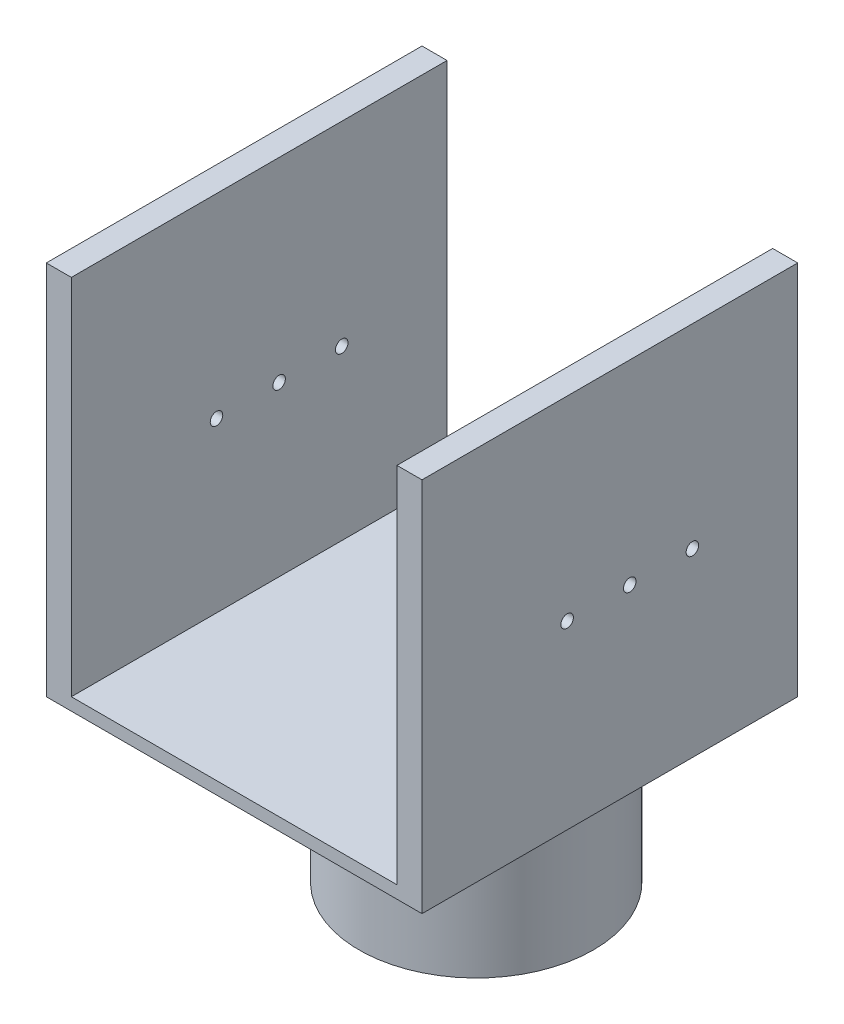
ISO-10303-21;
HEADER;
FILE_DESCRIPTION(('STEP AP214'),'2;1');
FILE_NAME('part.step','',(''),(''),'','','');
FILE_SCHEMA(('AUTOMOTIVE_DESIGN { 1 0 10303 214 1 1 1 1 }'));
ENDSEC;
DATA;
#1=APPLICATION_CONTEXT('core data for automotive mechanical design processes');
#2=APPLICATION_PROTOCOL_DEFINITION('international standard','automotive_design',2000,#1);
#3=PRODUCT_CONTEXT('',#1,'mechanical');
#4=PRODUCT('Part','Part','',(#3));
#5=PRODUCT_RELATED_PRODUCT_CATEGORY('part','',(#4));
#6=PRODUCT_DEFINITION_FORMATION('','',#4);
#7=PRODUCT_DEFINITION_CONTEXT('part definition',#1,'design');
#8=PRODUCT_DEFINITION('design','',#6,#7);
#9=PRODUCT_DEFINITION_SHAPE('','',#8);
#10=(LENGTH_UNIT() NAMED_UNIT(*) SI_UNIT(.MILLI.,.METRE.));
#11=(NAMED_UNIT(*) PLANE_ANGLE_UNIT() SI_UNIT($,.RADIAN.));
#12=(NAMED_UNIT(*) SI_UNIT($,.STERADIAN.) SOLID_ANGLE_UNIT());
#13=UNCERTAINTY_MEASURE_WITH_UNIT(LENGTH_MEASURE(1.E-05),#10,'distance_accuracy_value','');
#14=(GEOMETRIC_REPRESENTATION_CONTEXT(3) GLOBAL_UNCERTAINTY_ASSIGNED_CONTEXT((#13)) GLOBAL_UNIT_ASSIGNED_CONTEXT((#10,
#11,#12)) REPRESENTATION_CONTEXT('',''));
#15=CARTESIAN_POINT('',(0.,0.,0.));
#16=DIRECTION('',(0.,0.,1.));
#17=DIRECTION('',(1.,0.,0.));
#18=AXIS2_PLACEMENT_3D('',#15,#16,#17);
#19=CARTESIAN_POINT('',(28.,0.,30.));
#20=DIRECTION('',(-1.,0.,0.));
#21=DIRECTION('',(0.,-1.,0.));
#22=AXIS2_PLACEMENT_3D('',#19,#20,#21);
#23=PLANE('',#22);
#24=CARTESIAN_POINT('',(28.,14.4422067420435,8.40933037537323));
#25=DIRECTION('',(-1.,0.,0.));
#26=DIRECTION('',(0.,-1.,0.));
#27=AXIS2_PLACEMENT_3D('',#24,#25,#26);
#28=CIRCLE('',#27,0.500000000000001);
#29=CARTESIAN_POINT('',(28.,13.9422067420435,8.40933037537323));
#30=VERTEX_POINT('',#29);
#31=EDGE_CURVE('E187',#30,#30,#28,.T.);
#32=ORIENTED_EDGE('',*,*,#31,.F.);
#33=EDGE_LOOP('',(#32));
#34=FACE_BOUND('',#33,.T.);
#35=CARTESIAN_POINT('',(28.,14.4422067420435,13.4093303753732));
#36=DIRECTION('',(-1.,0.,0.));
#37=DIRECTION('',(0.,-1.,0.));
#38=AXIS2_PLACEMENT_3D('',#35,#36,#37);
#39=CIRCLE('',#38,0.500000000000001);
#40=CARTESIAN_POINT('',(28.,13.9422067420435,13.4093303753732));
#41=VERTEX_POINT('',#40);
#42=EDGE_CURVE('E172',#41,#41,#39,.T.);
#43=ORIENTED_EDGE('',*,*,#42,.F.);
#44=EDGE_LOOP('',(#43));
#45=FACE_BOUND('',#44,.T.);
#46=CARTESIAN_POINT('',(28.,14.4422067420435,18.4093303753732));
#47=DIRECTION('',(-1.,0.,0.));
#48=DIRECTION('',(0.,-1.,0.));
#49=AXIS2_PLACEMENT_3D('',#46,#47,#48);
#50=CIRCLE('',#49,0.499999999999999);
#51=CARTESIAN_POINT('',(28.,13.9422067420435,18.4093303753732));
#52=VERTEX_POINT('',#51);
#53=EDGE_CURVE('E168',#52,#52,#50,.T.);
#54=ORIENTED_EDGE('',*,*,#53,.F.);
#55=EDGE_LOOP('',(#54));
#56=FACE_BOUND('',#55,.T.);
#57=DIRECTION('',(0.,1.,0.));
#58=VECTOR('',#57,1.);
#59=CARTESIAN_POINT('',(28.,0.,0.));
#60=LINE('',#59,#58);
#61=CARTESIAN_POINT('',(28.,0.999999999999997,0.));
#62=VERTEX_POINT('',#61);
#63=CARTESIAN_POINT('',(28.,30.,0.));
#64=VERTEX_POINT('',#63);
#65=EDGE_CURVE('E132',#62,#64,#60,.T.);
#66=ORIENTED_EDGE('',*,*,#65,.F.);
#67=DIRECTION('',(0.,0.,-1.));
#68=VECTOR('',#67,1.);
#69=CARTESIAN_POINT('',(28.,0.999999999999997,30.));
#70=LINE('',#69,#68);
#71=CARTESIAN_POINT('',(28.,0.999999999999997,30.));
#72=VERTEX_POINT('',#71);
#73=EDGE_CURVE('E44',#72,#62,#70,.T.);
#74=ORIENTED_EDGE('',*,*,#73,.F.);
#75=DIRECTION('',(0.,1.,0.));
#76=VECTOR('',#75,1.);
#77=CARTESIAN_POINT('',(28.,0.,30.));
#78=LINE('',#77,#76);
#79=CARTESIAN_POINT('',(28.,30.,30.));
#80=VERTEX_POINT('',#79);
#81=EDGE_CURVE('E198',#72,#80,#78,.T.);
#82=ORIENTED_EDGE('',*,*,#81,.T.);
#83=DIRECTION('',(0.,0.,-1.));
#84=VECTOR('',#83,1.);
#85=CARTESIAN_POINT('',(28.,30.,30.));
#86=LINE('',#85,#84);
#87=EDGE_CURVE('E53',#80,#64,#86,.T.);
#88=ORIENTED_EDGE('',*,*,#87,.T.);
#89=EDGE_LOOP('',(#66,#74,#82,#88));
#90=FACE_BOUND('',#89,.T.);
#91=ADVANCED_FACE('F35',(#34,#45,#56,#90),#23,.T.);
#92=CARTESIAN_POINT('',(0.,0.999999999999997,30.));
#93=DIRECTION('',(0.,1.,0.));
#94=DIRECTION('',(0.,0.,1.));
#95=AXIS2_PLACEMENT_3D('',#92,#93,#94);
#96=PLANE('',#95);
#97=DIRECTION('',(1.,0.,0.));
#98=VECTOR('',#97,1.);
#99=CARTESIAN_POINT('',(0.,0.999999999999997,0.));
#100=LINE('',#99,#98);
#101=CARTESIAN_POINT('',(1.999996,0.999999999999997,0.));
#102=VERTEX_POINT('',#101);
#103=EDGE_CURVE('E134',#102,#62,#100,.T.);
#104=ORIENTED_EDGE('',*,*,#103,.F.);
#105=DIRECTION('',(0.,0.,-1.));
#106=VECTOR('',#105,1.);
#107=CARTESIAN_POINT('',(1.999996,0.999999999999997,30.));
#108=LINE('',#107,#106);
#109=CARTESIAN_POINT('',(1.999996,0.999999999999997,30.));
#110=VERTEX_POINT('',#109);
#111=EDGE_CURVE('E158',#110,#102,#108,.T.);
#112=ORIENTED_EDGE('',*,*,#111,.F.);
#113=DIRECTION('',(1.,0.,0.));
#114=VECTOR('',#113,1.);
#115=CARTESIAN_POINT('',(0.,0.999999999999997,30.));
#116=LINE('',#115,#114);
#117=EDGE_CURVE('E200',#110,#72,#116,.T.);
#118=ORIENTED_EDGE('',*,*,#117,.T.);
#119=ORIENTED_EDGE('',*,*,#73,.T.);
#120=EDGE_LOOP('',(#104,#112,#118,#119));
#121=FACE_BOUND('',#120,.T.);
#122=ADVANCED_FACE('F229',(#121),#96,.T.);
#123=CARTESIAN_POINT('',(1.999996,0.,30.));
#124=DIRECTION('',(1.,0.,0.));
#125=DIRECTION('',(0.,1.,0.));
#126=AXIS2_PLACEMENT_3D('',#123,#124,#125);
#127=PLANE('',#126);
#128=CARTESIAN_POINT('',(1.999996,14.4422067420435,8.40933037537323));
#129=DIRECTION('',(1.,0.,0.));
#130=DIRECTION('',(0.,1.,0.));
#131=AXIS2_PLACEMENT_3D('',#128,#129,#130);
#132=CIRCLE('',#131,0.500000000000001);
#133=CARTESIAN_POINT('',(1.999996,14.9422067420435,8.40933037537323));
#134=VERTEX_POINT('',#133);
#135=EDGE_CURVE('E184',#134,#134,#132,.T.);
#136=ORIENTED_EDGE('',*,*,#135,.F.);
#137=EDGE_LOOP('',(#136));
#138=FACE_BOUND('',#137,.T.);
#139=CARTESIAN_POINT('',(1.999996,14.4422067420435,13.4093303753732));
#140=DIRECTION('',(1.,0.,0.));
#141=DIRECTION('',(0.,1.,0.));
#142=AXIS2_PLACEMENT_3D('',#139,#140,#141);
#143=CIRCLE('',#142,0.500000000000001);
#144=CARTESIAN_POINT('',(1.999996,14.9422067420435,13.4093303753732));
#145=VERTEX_POINT('',#144);
#146=EDGE_CURVE('E167',#145,#145,#143,.T.);
#147=ORIENTED_EDGE('',*,*,#146,.F.);
#148=EDGE_LOOP('',(#147));
#149=FACE_BOUND('',#148,.T.);
#150=CARTESIAN_POINT('',(1.999996,14.4422067420435,18.4093303753732));
#151=DIRECTION('',(1.,0.,0.));
#152=DIRECTION('',(0.,1.,0.));
#153=AXIS2_PLACEMENT_3D('',#150,#151,#152);
#154=CIRCLE('',#153,0.499999999999999);
#155=CARTESIAN_POINT('',(1.999996,14.9422067420435,18.4093303753732));
#156=VERTEX_POINT('',#155);
#157=EDGE_CURVE('E163',#156,#156,#154,.T.);
#158=ORIENTED_EDGE('',*,*,#157,.F.);
#159=EDGE_LOOP('',(#158));
#160=FACE_BOUND('',#159,.T.);
#161=DIRECTION('',(0.,-1.,0.));
#162=VECTOR('',#161,1.);
#163=CARTESIAN_POINT('',(1.999996,0.,0.));
#164=LINE('',#163,#162);
#165=CARTESIAN_POINT('',(1.999996,30.,0.));
#166=VERTEX_POINT('',#165);
#167=EDGE_CURVE('E138',#166,#102,#164,.T.);
#168=ORIENTED_EDGE('',*,*,#167,.F.);
#169=DIRECTION('',(0.,0.,-1.));
#170=VECTOR('',#169,1.);
#171=CARTESIAN_POINT('',(1.999996,30.,30.));
#172=LINE('',#171,#170);
#173=CARTESIAN_POINT('',(1.999996,30.,30.));
#174=VERTEX_POINT('',#173);
#175=EDGE_CURVE('E156',#174,#166,#172,.T.);
#176=ORIENTED_EDGE('',*,*,#175,.F.);
#177=DIRECTION('',(0.,-1.,0.));
#178=VECTOR('',#177,1.);
#179=CARTESIAN_POINT('',(1.999996,0.,30.));
#180=LINE('',#179,#178);
#181=EDGE_CURVE('E203',#174,#110,#180,.T.);
#182=ORIENTED_EDGE('',*,*,#181,.T.);
#183=ORIENTED_EDGE('',*,*,#111,.T.);
#184=EDGE_LOOP('',(#168,#176,#182,#183));
#185=FACE_BOUND('',#184,.T.);
#186=ADVANCED_FACE('F226',(#138,#149,#160,#185),#127,.T.);
#187=CARTESIAN_POINT('',(0.,30.,30.));
#188=DIRECTION('',(0.,1.,0.));
#189=DIRECTION('',(0.,0.,1.));
#190=AXIS2_PLACEMENT_3D('',#187,#188,#189);
#191=PLANE('',#190);
#192=DIRECTION('',(1.,0.,0.));
#193=VECTOR('',#192,1.);
#194=CARTESIAN_POINT('',(0.,30.,0.));
#195=LINE('',#194,#193);
#196=CARTESIAN_POINT('',(0.,30.,0.));
#197=VERTEX_POINT('',#196);
#198=EDGE_CURVE('E141',#197,#166,#195,.T.);
#199=ORIENTED_EDGE('',*,*,#198,.F.);
#200=DIRECTION('',(0.,0.,-1.));
#201=VECTOR('',#200,1.);
#202=CARTESIAN_POINT('',(0.,30.,30.));
#203=LINE('',#202,#201);
#204=CARTESIAN_POINT('',(0.,30.,30.));
#205=VERTEX_POINT('',#204);
#206=EDGE_CURVE('E154',#205,#197,#203,.T.);
#207=ORIENTED_EDGE('',*,*,#206,.F.);
#208=DIRECTION('',(1.,0.,0.));
#209=VECTOR('',#208,1.);
#210=CARTESIAN_POINT('',(0.,30.,30.));
#211=LINE('',#210,#209);
#212=EDGE_CURVE('E129',#205,#174,#211,.T.);
#213=ORIENTED_EDGE('',*,*,#212,.T.);
#214=ORIENTED_EDGE('',*,*,#175,.T.);
#215=EDGE_LOOP('',(#199,#207,#213,#214));
#216=FACE_BOUND('',#215,.T.);
#217=ADVANCED_FACE('F216',(#216),#191,.T.);
#218=CARTESIAN_POINT('',(0.,0.,30.));
#219=DIRECTION('',(-1.,0.,0.));
#220=DIRECTION('',(0.,0.,1.));
#221=AXIS2_PLACEMENT_3D('',#218,#219,#220);
#222=PLANE('',#221);
#223=CARTESIAN_POINT('',(0.,14.4422067420435,8.40933037537323));
#224=DIRECTION('',(-1.,0.,0.));
#225=DIRECTION('',(0.,0.,1.));
#226=AXIS2_PLACEMENT_3D('',#223,#224,#225);
#227=CIRCLE('',#226,0.500000000000001);
#228=CARTESIAN_POINT('',(0.,14.4422067420435,8.90933037537323));
#229=VERTEX_POINT('',#228);
#230=EDGE_CURVE('E164',#229,#229,#227,.T.);
#231=ORIENTED_EDGE('',*,*,#230,.F.);
#232=EDGE_LOOP('',(#231));
#233=FACE_BOUND('',#232,.T.);
#234=CARTESIAN_POINT('',(0.,14.4422067420435,13.4093303753732));
#235=DIRECTION('',(-1.,0.,0.));
#236=DIRECTION('',(0.,0.,1.));
#237=AXIS2_PLACEMENT_3D('',#234,#235,#236);
#238=CIRCLE('',#237,0.500000000000001);
#239=CARTESIAN_POINT('',(0.,14.4422067420435,13.9093303753732));
#240=VERTEX_POINT('',#239);
#241=EDGE_CURVE('E421',#240,#240,#238,.T.);
#242=ORIENTED_EDGE('',*,*,#241,.F.);
#243=EDGE_LOOP('',(#242));
#244=FACE_BOUND('',#243,.T.);
#245=CARTESIAN_POINT('',(0.,14.4422067420435,18.4093303753732));
#246=DIRECTION('',(-1.,0.,0.));
#247=DIRECTION('',(0.,0.,1.));
#248=AXIS2_PLACEMENT_3D('',#245,#246,#247);
#249=CIRCLE('',#248,0.499999999999999);
#250=CARTESIAN_POINT('',(0.,14.4422067420435,18.9093303753732));
#251=VERTEX_POINT('',#250);
#252=EDGE_CURVE('E424',#251,#251,#249,.T.);
#253=ORIENTED_EDGE('',*,*,#252,.F.);
#254=EDGE_LOOP('',(#253));
#255=FACE_BOUND('',#254,.T.);
#256=DIRECTION('',(0.,1.,0.));
#257=VECTOR('',#256,1.);
#258=CARTESIAN_POINT('',(0.,0.,0.));
#259=LINE('',#258,#257);
#260=CARTESIAN_POINT('',(0.,0.,0.));
#261=VERTEX_POINT('',#260);
#262=EDGE_CURVE('E144',#261,#197,#259,.T.);
#263=ORIENTED_EDGE('',*,*,#262,.F.);
#264=DIRECTION('',(0.,0.,-1.));
#265=VECTOR('',#264,1.);
#266=CARTESIAN_POINT('',(0.,0.,30.));
#267=LINE('',#266,#265);
#268=CARTESIAN_POINT('',(0.,0.,30.));
#269=VERTEX_POINT('',#268);
#270=EDGE_CURVE('E113',#269,#261,#267,.T.);
#271=ORIENTED_EDGE('',*,*,#270,.F.);
#272=DIRECTION('',(0.,1.,0.));
#273=VECTOR('',#272,1.);
#274=CARTESIAN_POINT('',(0.,0.,30.));
#275=LINE('',#274,#273);
#276=EDGE_CURVE('E123',#269,#205,#275,.T.);
#277=ORIENTED_EDGE('',*,*,#276,.T.);
#278=ORIENTED_EDGE('',*,*,#206,.T.);
#279=EDGE_LOOP('',(#263,#271,#277,#278));
#280=FACE_BOUND('',#279,.T.);
#281=ADVANCED_FACE('F208',(#233,#244,#255,#280),#222,.T.);
#282=CARTESIAN_POINT('',(0.,0.,30.));
#283=DIRECTION('',(0.,-1.,0.));
#284=DIRECTION('',(1.,0.,0.));
#285=AXIS2_PLACEMENT_3D('',#282,#283,#284);
#286=PLANE('',#285);
#287=CARTESIAN_POINT('',(15.,0.,10.6696297439818));
#288=DIRECTION('',(0.,-1.,0.));
#289=DIRECTION('',(1.,0.,0.));
#290=AXIS2_PLACEMENT_3D('',#287,#288,#289);
#291=CIRCLE('',#290,9.35702765263944);
#292=CARTESIAN_POINT('',(24.3570276526394,0.,10.6696297439818));
#293=VERTEX_POINT('',#292);
#294=EDGE_CURVE('E11',#293,#293,#291,.T.);
#295=ORIENTED_EDGE('',*,*,#294,.F.);
#296=EDGE_LOOP('',(#295));
#297=FACE_BOUND('',#296,.T.);
#298=DIRECTION('',(-1.,0.,0.));
#299=VECTOR('',#298,1.);
#300=CARTESIAN_POINT('',(0.,0.,0.));
#301=LINE('',#300,#299);
#302=CARTESIAN_POINT('',(30.,0.,0.));
#303=VERTEX_POINT('',#302);
#304=EDGE_CURVE('E109',#303,#261,#301,.T.);
#305=ORIENTED_EDGE('',*,*,#304,.F.);
#306=DIRECTION('',(0.,0.,-1.));
#307=VECTOR('',#306,1.);
#308=CARTESIAN_POINT('',(30.,0.,30.));
#309=LINE('',#308,#307);
#310=CARTESIAN_POINT('',(30.,0.,30.));
#311=VERTEX_POINT('',#310);
#312=EDGE_CURVE('E104',#311,#303,#309,.T.);
#313=ORIENTED_EDGE('',*,*,#312,.F.);
#314=DIRECTION('',(-1.,0.,0.));
#315=VECTOR('',#314,1.);
#316=CARTESIAN_POINT('',(0.,0.,30.));
#317=LINE('',#316,#315);
#318=EDGE_CURVE('E107',#311,#269,#317,.T.);
#319=ORIENTED_EDGE('',*,*,#318,.T.);
#320=ORIENTED_EDGE('',*,*,#270,.T.);
#321=EDGE_LOOP('',(#305,#313,#319,#320));
#322=FACE_BOUND('',#321,.T.);
#323=ADVANCED_FACE('F106',(#297,#322),#286,.T.);
#324=CARTESIAN_POINT('',(30.,0.,30.));
#325=DIRECTION('',(1.,0.,0.));
#326=DIRECTION('',(0.,1.,0.));
#327=AXIS2_PLACEMENT_3D('',#324,#325,#326);
#328=PLANE('',#327);
#329=CARTESIAN_POINT('',(30.,14.4422067420435,8.40933037537323));
#330=DIRECTION('',(1.,0.,0.));
#331=DIRECTION('',(0.,1.,0.));
#332=AXIS2_PLACEMENT_3D('',#329,#330,#331);
#333=CIRCLE('',#332,0.500000000000001);
#334=CARTESIAN_POINT('',(30.,14.9422067420435,8.40933037537323));
#335=VERTEX_POINT('',#334);
#336=EDGE_CURVE('E38',#335,#335,#333,.T.);
#337=ORIENTED_EDGE('',*,*,#336,.F.);
#338=EDGE_LOOP('',(#337));
#339=FACE_BOUND('',#338,.T.);
#340=CARTESIAN_POINT('',(30.,14.4422067420435,13.4093303753732));
#341=DIRECTION('',(1.,0.,0.));
#342=DIRECTION('',(0.,1.,0.));
#343=AXIS2_PLACEMENT_3D('',#340,#341,#342);
#344=CIRCLE('',#343,0.500000000000001);
#345=CARTESIAN_POINT('',(30.,14.9422067420435,13.4093303753732));
#346=VERTEX_POINT('',#345);
#347=EDGE_CURVE('E165',#346,#346,#344,.T.);
#348=ORIENTED_EDGE('',*,*,#347,.F.);
#349=EDGE_LOOP('',(#348));
#350=FACE_BOUND('',#349,.T.);
#351=CARTESIAN_POINT('',(30.,14.4422067420435,18.4093303753732));
#352=DIRECTION('',(1.,0.,0.));
#353=DIRECTION('',(0.,1.,0.));
#354=AXIS2_PLACEMENT_3D('',#351,#352,#353);
#355=CIRCLE('',#354,0.499999999999999);
#356=CARTESIAN_POINT('',(30.,14.9422067420435,18.4093303753732));
#357=VERTEX_POINT('',#356);
#358=EDGE_CURVE('E161',#357,#357,#355,.T.);
#359=ORIENTED_EDGE('',*,*,#358,.F.);
#360=EDGE_LOOP('',(#359));
#361=FACE_BOUND('',#360,.T.);
#362=DIRECTION('',(0.,-1.,0.));
#363=VECTOR('',#362,1.);
#364=CARTESIAN_POINT('',(30.,0.,0.));
#365=LINE('',#364,#363);
#366=CARTESIAN_POINT('',(30.,30.,0.));
#367=VERTEX_POINT('',#366);
#368=EDGE_CURVE('E149',#367,#303,#365,.T.);
#369=ORIENTED_EDGE('',*,*,#368,.F.);
#370=DIRECTION('',(0.,0.,-1.));
#371=VECTOR('',#370,1.);
#372=CARTESIAN_POINT('',(30.,30.,30.));
#373=LINE('',#372,#371);
#374=CARTESIAN_POINT('',(30.,30.,30.));
#375=VERTEX_POINT('',#374);
#376=EDGE_CURVE('E79',#375,#367,#373,.T.);
#377=ORIENTED_EDGE('',*,*,#376,.F.);
#378=DIRECTION('',(0.,-1.,0.));
#379=VECTOR('',#378,1.);
#380=CARTESIAN_POINT('',(30.,0.,30.));
#381=LINE('',#380,#379);
#382=EDGE_CURVE('E120',#375,#311,#381,.T.);
#383=ORIENTED_EDGE('',*,*,#382,.T.);
#384=ORIENTED_EDGE('',*,*,#312,.T.);
#385=EDGE_LOOP('',(#369,#377,#383,#384));
#386=FACE_BOUND('',#385,.T.);
#387=ADVANCED_FACE('F125',(#339,#350,#361,#386),#328,.T.);
#388=EDGE_CURVE('E145',#64,#367,#195,.T.);
#389=ORIENTED_EDGE('',*,*,#388,.F.);
#390=ORIENTED_EDGE('',*,*,#87,.F.);
#391=EDGE_CURVE('E126',#80,#375,#211,.T.);
#392=ORIENTED_EDGE('',*,*,#391,.T.);
#393=ORIENTED_EDGE('',*,*,#376,.T.);
#394=EDGE_LOOP('',(#389,#390,#392,#393));
#395=FACE_BOUND('',#394,.T.);
#396=ADVANCED_FACE('F213',(#395),#191,.T.);
#397=CARTESIAN_POINT('',(0.,0.,30.));
#398=DIRECTION('',(0.,0.,1.));
#399=DIRECTION('',(1.,0.,0.));
#400=AXIS2_PLACEMENT_3D('',#397,#398,#399);
#401=PLANE('',#400);
#402=ORIENTED_EDGE('',*,*,#81,.F.);
#403=ORIENTED_EDGE('',*,*,#117,.F.);
#404=ORIENTED_EDGE('',*,*,#181,.F.);
#405=ORIENTED_EDGE('',*,*,#212,.F.);
#406=ORIENTED_EDGE('',*,*,#276,.F.);
#407=ORIENTED_EDGE('',*,*,#318,.F.);
#408=ORIENTED_EDGE('',*,*,#382,.F.);
#409=ORIENTED_EDGE('',*,*,#391,.F.);
#410=EDGE_LOOP('',(#402,#403,#404,#405,#406,#407,#408,#409));
#411=FACE_BOUND('',#410,.T.);
#412=ADVANCED_FACE('F118',(#411),#401,.T.);
#413=CARTESIAN_POINT('',(0.,0.,0.));
#414=DIRECTION('',(0.,0.,1.));
#415=DIRECTION('',(1.,0.,0.));
#416=AXIS2_PLACEMENT_3D('',#413,#414,#415);
#417=PLANE('',#416);
#418=ORIENTED_EDGE('',*,*,#65,.T.);
#419=ORIENTED_EDGE('',*,*,#388,.T.);
#420=ORIENTED_EDGE('',*,*,#368,.T.);
#421=ORIENTED_EDGE('',*,*,#304,.T.);
#422=ORIENTED_EDGE('',*,*,#262,.T.);
#423=ORIENTED_EDGE('',*,*,#198,.T.);
#424=ORIENTED_EDGE('',*,*,#167,.T.);
#425=ORIENTED_EDGE('',*,*,#103,.T.);
#426=EDGE_LOOP('',(#418,#419,#420,#421,#422,#423,#424,#425));
#427=FACE_BOUND('',#426,.T.);
#428=ADVANCED_FACE('F211',(#427),#417,.F.);
#429=CARTESIAN_POINT('',(15.,-15.,10.6696297439818));
#430=DIRECTION('',(0.,1.,0.));
#431=DIRECTION('',(-1.,0.,0.));
#432=AXIS2_PLACEMENT_3D('',#429,#430,#431);
#433=CYLINDRICAL_SURFACE('',#432,9.35702765263944);
#434=CARTESIAN_POINT('',(15.,-15.,10.6696297439818));
#435=DIRECTION('',(0.,-1.,0.));
#436=DIRECTION('',(1.,0.,0.));
#437=AXIS2_PLACEMENT_3D('',#434,#435,#436);
#438=CIRCLE('',#437,9.35702765263944);
#439=CARTESIAN_POINT('',(24.3570276526394,-15.,10.6696297439818));
#440=VERTEX_POINT('',#439);
#441=EDGE_CURVE('E135',#440,#440,#438,.T.);
#442=ORIENTED_EDGE('',*,*,#441,.F.);
#443=EDGE_LOOP('',(#442));
#444=FACE_BOUND('',#443,.T.);
#445=ORIENTED_EDGE('',*,*,#294,.T.);
#446=EDGE_LOOP('',(#445));
#447=FACE_BOUND('',#446,.T.);
#448=ADVANCED_FACE('F261',(#444,#447),#433,.T.);
#449=CARTESIAN_POINT('',(15.,-15.,10.6696297439818));
#450=DIRECTION('',(0.,-1.,0.));
#451=DIRECTION('',(1.,0.,0.));
#452=AXIS2_PLACEMENT_3D('',#449,#450,#451);
#453=PLANE('',#452);
#454=CARTESIAN_POINT('',(15.,-15.,10.6696297439818));
#455=DIRECTION('',(0.,-1.,0.));
#456=DIRECTION('',(1.,0.,0.));
#457=AXIS2_PLACEMENT_3D('',#454,#455,#456);
#458=CIRCLE('',#457,8.50485357636811);
#459=CARTESIAN_POINT('',(23.5048535763681,-15.,10.6696297439818));
#460=VERTEX_POINT('',#459);
#461=EDGE_CURVE('E190',#460,#460,#458,.T.);
#462=ORIENTED_EDGE('',*,*,#461,.F.);
#463=EDGE_LOOP('',(#462));
#464=FACE_BOUND('',#463,.T.);
#465=ORIENTED_EDGE('',*,*,#441,.T.);
#466=EDGE_LOOP('',(#465));
#467=FACE_BOUND('',#466,.T.);
#468=ADVANCED_FACE('F263',(#464,#467),#453,.T.);
#469=CARTESIAN_POINT('',(15.,-9.13000000000001,10.6696297439818));
#470=DIRECTION('',(0.,-1.,0.));
#471=DIRECTION('',(1.,0.,0.));
#472=AXIS2_PLACEMENT_3D('',#469,#470,#471);
#473=CYLINDRICAL_SURFACE('',#472,8.50485357636811);
#474=CARTESIAN_POINT('',(15.,-9.13000000000001,10.6696297439818));
#475=DIRECTION('',(0.,-1.,0.));
#476=DIRECTION('',(1.,0.,0.));
#477=AXIS2_PLACEMENT_3D('',#474,#475,#476);
#478=CIRCLE('',#477,8.50485357636811);
#479=CARTESIAN_POINT('',(23.5048535763681,-9.13000000000001,10.6696297439818));
#480=VERTEX_POINT('',#479);
#481=EDGE_CURVE('E191',#480,#480,#478,.T.);
#482=CARTESIAN_POINT('',(23.5048535763681,-9.13000000000001,10.6696297439818));
#483=CARTESIAN_POINT('',(23.5048535763681,-9.19114583333334,10.6696297439818));
#484=CARTESIAN_POINT('',(23.5048535763681,-9.25229166666667,10.6696297439818));
#485=CARTESIAN_POINT('',(23.5048535763681,-9.37458333333334,10.6696297439818));
#486=CARTESIAN_POINT('',(23.5048535763681,-9.43572916666667,10.6696297439818));
#487=CARTESIAN_POINT('',(23.5048535763681,-9.55802083333334,10.6696297439818));
#488=CARTESIAN_POINT('',(23.5048535763681,-9.61916666666667,10.6696297439818));
#489=CARTESIAN_POINT('',(23.5048535763681,-9.74145833333334,10.6696297439818));
#490=CARTESIAN_POINT('',(23.5048535763681,-9.80260416666667,10.6696297439818));
#491=CARTESIAN_POINT('',(23.5048535763681,-9.92489583333334,10.6696297439818));
#492=CARTESIAN_POINT('',(23.5048535763681,-9.98604166666667,10.6696297439818));
#493=CARTESIAN_POINT('',(23.5048535763681,-10.1083333333333,10.6696297439818));
#494=CARTESIAN_POINT('',(23.5048535763681,-10.1694791666667,10.6696297439818));
#495=CARTESIAN_POINT('',(23.5048535763681,-10.2917708333333,10.6696297439818));
#496=CARTESIAN_POINT('',(23.5048535763681,-10.3529166666667,10.6696297439818));
#497=CARTESIAN_POINT('',(23.5048535763681,-10.4752083333333,10.6696297439818));
#498=CARTESIAN_POINT('',(23.5048535763681,-10.5363541666667,10.6696297439818));
#499=CARTESIAN_POINT('',(23.5048535763681,-10.6586458333333,10.6696297439818));
#500=CARTESIAN_POINT('',(23.5048535763681,-10.7197916666667,10.6696297439818));
#501=CARTESIAN_POINT('',(23.5048535763681,-10.8420833333333,10.6696297439818));
#502=CARTESIAN_POINT('',(23.5048535763681,-10.9032291666667,10.6696297439818));
#503=CARTESIAN_POINT('',(23.5048535763681,-11.0255208333333,10.6696297439818));
#504=CARTESIAN_POINT('',(23.5048535763681,-11.0866666666667,10.6696297439818));
#505=CARTESIAN_POINT('',(23.5048535763681,-11.2089583333333,10.6696297439818));
#506=CARTESIAN_POINT('',(23.5048535763681,-11.2701041666667,10.6696297439818));
#507=CARTESIAN_POINT('',(23.5048535763681,-11.3923958333333,10.6696297439818));
#508=CARTESIAN_POINT('',(23.5048535763681,-11.4535416666667,10.6696297439818));
#509=CARTESIAN_POINT('',(23.5048535763681,-11.5758333333333,10.6696297439818));
#510=CARTESIAN_POINT('',(23.5048535763681,-11.6369791666667,10.6696297439818));
#511=CARTESIAN_POINT('',(23.5048535763681,-11.7592708333333,10.6696297439818));
#512=CARTESIAN_POINT('',(23.5048535763681,-11.8204166666667,10.6696297439818));
#513=CARTESIAN_POINT('',(23.5048535763681,-11.9427083333333,10.6696297439818));
#514=CARTESIAN_POINT('',(23.5048535763681,-12.0038541666667,10.6696297439818));
#515=CARTESIAN_POINT('',(23.5048535763681,-12.1261458333333,10.6696297439818));
#516=CARTESIAN_POINT('',(23.5048535763681,-12.1872916666667,10.6696297439818));
#517=CARTESIAN_POINT('',(23.5048535763681,-12.3095833333333,10.6696297439818));
#518=CARTESIAN_POINT('',(23.5048535763681,-12.3707291666667,10.6696297439818));
#519=CARTESIAN_POINT('',(23.5048535763681,-12.4930208333333,10.6696297439818));
#520=CARTESIAN_POINT('',(23.5048535763681,-12.5541666666667,10.6696297439818));
#521=CARTESIAN_POINT('',(23.5048535763681,-12.6764583333333,10.6696297439818));
#522=CARTESIAN_POINT('',(23.5048535763681,-12.7376041666667,10.6696297439818));
#523=CARTESIAN_POINT('',(23.5048535763681,-12.8598958333333,10.6696297439818));
#524=CARTESIAN_POINT('',(23.5048535763681,-12.9210416666667,10.6696297439818));
#525=CARTESIAN_POINT('',(23.5048535763681,-13.0433333333333,10.6696297439818));
#526=CARTESIAN_POINT('',(23.5048535763681,-13.1044791666667,10.6696297439818));
#527=CARTESIAN_POINT('',(23.5048535763681,-13.2267708333333,10.6696297439818));
#528=CARTESIAN_POINT('',(23.5048535763681,-13.2879166666667,10.6696297439818));
#529=CARTESIAN_POINT('',(23.5048535763681,-13.4102083333333,10.6696297439818));
#530=CARTESIAN_POINT('',(23.5048535763681,-13.4713541666667,10.6696297439818));
#531=CARTESIAN_POINT('',(23.5048535763681,-13.5936458333333,10.6696297439818));
#532=CARTESIAN_POINT('',(23.5048535763681,-13.6547916666667,10.6696297439818));
#533=CARTESIAN_POINT('',(23.5048535763681,-13.7770833333333,10.6696297439818));
#534=CARTESIAN_POINT('',(23.5048535763681,-13.8382291666667,10.6696297439818));
#535=CARTESIAN_POINT('',(23.5048535763681,-13.9605208333333,10.6696297439818));
#536=CARTESIAN_POINT('',(23.5048535763681,-14.0216666666667,10.6696297439818));
#537=CARTESIAN_POINT('',(23.5048535763681,-14.1439583333333,10.6696297439818));
#538=CARTESIAN_POINT('',(23.5048535763681,-14.2051041666667,10.6696297439818));
#539=CARTESIAN_POINT('',(23.5048535763681,-14.3273958333333,10.6696297439818));
#540=CARTESIAN_POINT('',(23.5048535763681,-14.3885416666667,10.6696297439818));
#541=CARTESIAN_POINT('',(23.5048535763681,-14.5108333333333,10.6696297439818));
#542=CARTESIAN_POINT('',(23.5048535763681,-14.5719791666667,10.6696297439818));
#543=CARTESIAN_POINT('',(23.5048535763681,-14.6942708333333,10.6696297439818));
#544=CARTESIAN_POINT('',(23.5048535763681,-14.7554166666667,10.6696297439818));
#545=CARTESIAN_POINT('',(23.5048535763681,-14.8777083333333,10.6696297439818));
#546=CARTESIAN_POINT('',(23.5048535763681,-14.9388541666667,10.6696297439818));
#547=CARTESIAN_POINT('',(23.5048535763681,-15.,10.6696297439818));
#548=B_SPLINE_CURVE_WITH_KNOTS('',3,(#482,#483,#484,#485,#486,#487,#488,#489,#490,#491,#492,
#493,#494,#495,#496,#497,#498,#499,#500,#501,#502,#503,#504,#505,#506,#507,#508,#509,#510,#511,
#512,#513,#514,#515,#516,#517,#518,#519,#520,#521,#522,#523,#524,#525,#526,#527,#528,#529,#530,
#531,#532,#533,#534,#535,#536,#537,#538,#539,#540,#541,#542,#543,#544,#545,#546,#547),
.UNSPECIFIED.,.F.,.F.,(4,2,2,2,2,2,2,2,2,2,2,2,2,2,2,2,2,2,2,2,2,2,2,2,2,2,2,2,2,2,2,2,4),(0.,
0.183437500000001,0.366875000000001,0.5503125,0.73375,0.9171875,1.100625,1.2840625,1.4675,
1.6509375,1.834375,2.0178125,2.20125,2.3846875,2.568125,2.7515625,2.935,3.1184375,3.301875,
3.4853125,3.66875,3.8521875,4.035625,4.2190625,4.4025,4.58593749999999,4.769375,4.9528125,
5.13625,5.31968749999999,5.50312499999999,5.6865625,5.86999999999999),.UNSPECIFIED.);
#549=EDGE_CURVE('BSEAM270',#480,#460,#548,.T.);
#550=ORIENTED_EDGE('',*,*,#481,.F.);
#551=ORIENTED_EDGE('',*,*,#461,.T.);
#552=ORIENTED_EDGE('',*,*,#549,.T.);
#553=ORIENTED_EDGE('',*,*,#549,.F.);
#554=EDGE_LOOP('',(#550,#552,#551,#553));
#555=FACE_BOUND('',#554,.T.);
#556=ADVANCED_FACE('F270',(#555),#473,.F.);
#557=CARTESIAN_POINT('',(15.,-9.13000000000001,10.6696297439818));
#558=DIRECTION('',(0.,-1.,0.));
#559=DIRECTION('',(1.,0.,0.));
#560=AXIS2_PLACEMENT_3D('',#557,#558,#559);
#561=PLANE('',#560);
#562=ORIENTED_EDGE('',*,*,#481,.T.);
#563=EDGE_LOOP('',(#562));
#564=FACE_BOUND('',#563,.T.);
#565=ADVANCED_FACE('F277',(#564),#561,.T.);
#566=CARTESIAN_POINT('',(37.592,14.4422067420435,18.4093303753732));
#567=DIRECTION('',(-1.,0.,0.));
#568=DIRECTION('',(0.,0.,1.));
#569=AXIS2_PLACEMENT_3D('',#566,#567,#568);
#570=CYLINDRICAL_SURFACE('',#569,0.499999999999999);
#571=ORIENTED_EDGE('',*,*,#53,.T.);
#572=EDGE_LOOP('',(#571));
#573=FACE_BOUND('',#572,.T.);
#574=ORIENTED_EDGE('',*,*,#358,.T.);
#575=EDGE_LOOP('',(#574));
#576=FACE_BOUND('',#575,.T.);
#577=ADVANCED_FACE('F281',(#573,#576),#570,.F.);
#578=CARTESIAN_POINT('',(37.592,14.4422067420435,13.4093303753732));
#579=DIRECTION('',(-1.,0.,0.));
#580=DIRECTION('',(0.,0.,1.));
#581=AXIS2_PLACEMENT_3D('',#578,#579,#580);
#582=CYLINDRICAL_SURFACE('',#581,0.500000000000001);
#583=ORIENTED_EDGE('',*,*,#42,.T.);
#584=EDGE_LOOP('',(#583));
#585=FACE_BOUND('',#584,.T.);
#586=ORIENTED_EDGE('',*,*,#347,.T.);
#587=EDGE_LOOP('',(#586));
#588=FACE_BOUND('',#587,.T.);
#589=ADVANCED_FACE('F293',(#585,#588),#582,.F.);
#590=CARTESIAN_POINT('',(37.592,14.4422067420435,8.40933037537323));
#591=DIRECTION('',(-1.,0.,0.));
#592=DIRECTION('',(0.,0.,1.));
#593=AXIS2_PLACEMENT_3D('',#590,#591,#592);
#594=CYLINDRICAL_SURFACE('',#593,0.500000000000001);
#595=ORIENTED_EDGE('',*,*,#31,.T.);
#596=EDGE_LOOP('',(#595));
#597=FACE_BOUND('',#596,.T.);
#598=ORIENTED_EDGE('',*,*,#336,.T.);
#599=EDGE_LOOP('',(#598));
#600=FACE_BOUND('',#599,.T.);
#601=ADVANCED_FACE('F287',(#597,#600),#594,.F.);
#602=ORIENTED_EDGE('',*,*,#157,.T.);
#603=EDGE_LOOP('',(#602));
#604=FACE_BOUND('',#603,.T.);
#605=ORIENTED_EDGE('',*,*,#252,.T.);
#606=EDGE_LOOP('',(#605));
#607=FACE_BOUND('',#606,.T.);
#608=ADVANCED_FACE('F283',(#604,#607),#570,.F.);
#609=ORIENTED_EDGE('',*,*,#146,.T.);
#610=EDGE_LOOP('',(#609));
#611=FACE_BOUND('',#610,.T.);
#612=ORIENTED_EDGE('',*,*,#241,.T.);
#613=EDGE_LOOP('',(#612));
#614=FACE_BOUND('',#613,.T.);
#615=ADVANCED_FACE('F286',(#611,#614),#582,.F.);
#616=ORIENTED_EDGE('',*,*,#135,.T.);
#617=EDGE_LOOP('',(#616));
#618=FACE_BOUND('',#617,.T.);
#619=ORIENTED_EDGE('',*,*,#230,.T.);
#620=EDGE_LOOP('',(#619));
#621=FACE_BOUND('',#620,.T.);
#622=ADVANCED_FACE('F291',(#618,#621),#594,.F.);
#623=CLOSED_SHELL('',(#91,#122,#186,#217,#281,#323,#387,#396,#412,#428,#448,#468,#556,#565,#577,
#589,#601,#608,#615,#622));
#624=MANIFOLD_SOLID_BREP('B2',#623);
#625=ADVANCED_BREP_SHAPE_REPRESENTATION('',(#18,#624),#14);
#626=SHAPE_DEFINITION_REPRESENTATION(#9,#625);
ENDSEC;
END-ISO-10303-21;
